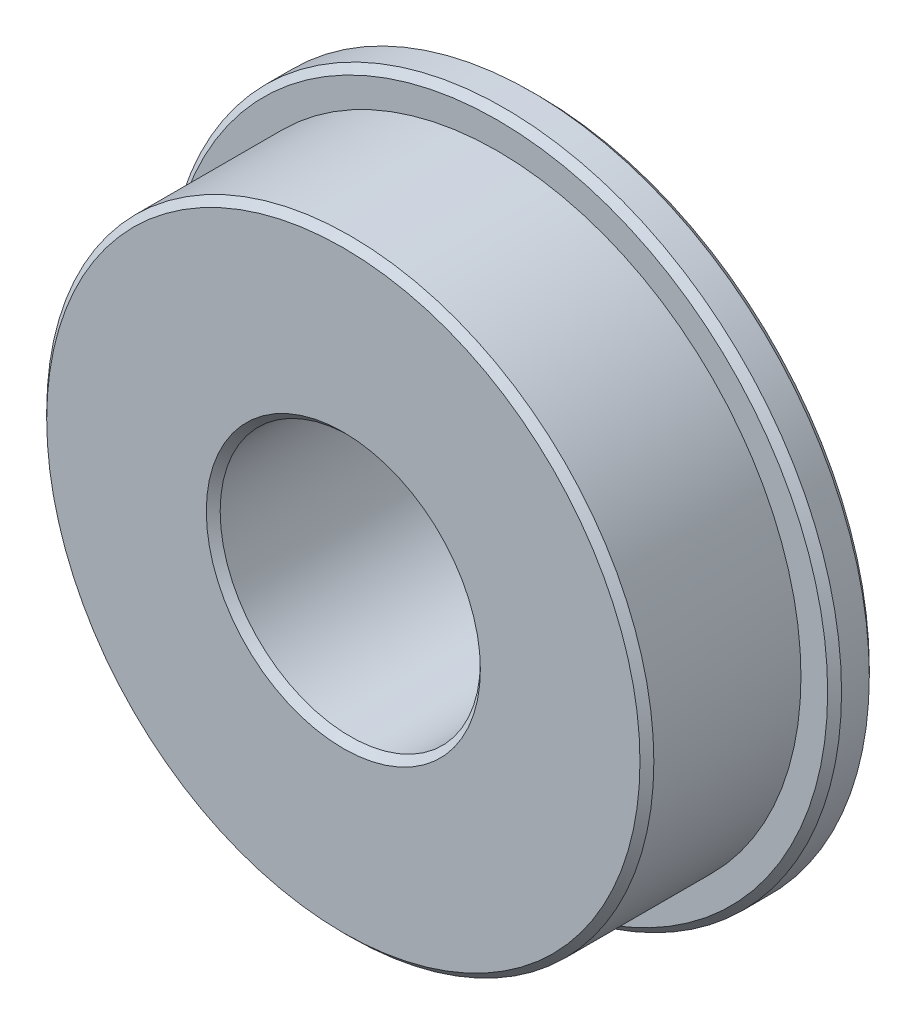
ISO-10303-21;
HEADER;
FILE_DESCRIPTION(('STEP AP214'),'2;1');
FILE_NAME('part.step','',(''),(''),'','','');
FILE_SCHEMA(('AUTOMOTIVE_DESIGN { 1 0 10303 214 1 1 1 1 }'));
ENDSEC;
DATA;
#1=APPLICATION_CONTEXT('core data for automotive mechanical design processes');
#2=APPLICATION_PROTOCOL_DEFINITION('international standard','automotive_design',2000,#1);
#3=PRODUCT_CONTEXT('',#1,'mechanical');
#4=PRODUCT('Part','Part','',(#3));
#5=PRODUCT_RELATED_PRODUCT_CATEGORY('part','',(#4));
#6=PRODUCT_DEFINITION_FORMATION('','',#4);
#7=PRODUCT_DEFINITION_CONTEXT('part definition',#1,'design');
#8=PRODUCT_DEFINITION('design','',#6,#7);
#9=PRODUCT_DEFINITION_SHAPE('','',#8);
#10=(LENGTH_UNIT() NAMED_UNIT(*) SI_UNIT(.MILLI.,.METRE.));
#11=(NAMED_UNIT(*) PLANE_ANGLE_UNIT() SI_UNIT($,.RADIAN.));
#12=(NAMED_UNIT(*) SI_UNIT($,.STERADIAN.) SOLID_ANGLE_UNIT());
#13=UNCERTAINTY_MEASURE_WITH_UNIT(LENGTH_MEASURE(1.E-05),#10,'distance_accuracy_value','');
#14=(GEOMETRIC_REPRESENTATION_CONTEXT(3) GLOBAL_UNCERTAINTY_ASSIGNED_CONTEXT((#13)) GLOBAL_UNIT_ASSIGNED_CONTEXT((#10,
#11,#12)) REPRESENTATION_CONTEXT('',''));
#15=CARTESIAN_POINT('',(0.,0.,0.));
#16=DIRECTION('',(0.,0.,1.));
#17=DIRECTION('',(1.,0.,0.));
#18=AXIS2_PLACEMENT_3D('',#15,#16,#17);
#19=CARTESIAN_POINT('',(-8.86153846153845,6.04195804195806,-7.37869999999988));
#20=DIRECTION('',(0.,0.,-1.));
#21=DIRECTION('',(0.,-1.,0.));
#22=AXIS2_PLACEMENT_3D('',#19,#20,#21);
#23=CONICAL_SURFACE('',#22,25.4,0.78539816339745);
#24=CARTESIAN_POINT('',(-8.86153846153845,6.04195804195806,7.16280000000003));
#25=DIRECTION('',(0.,0.,1.));
#26=DIRECTION('',(1.,0.,0.));
#27=AXIS2_PLACEMENT_3D('',#24,#25,#26);
#28=CIRCLE('',#27,10.8585);
#29=CARTESIAN_POINT('',(1.99696153846156,6.04195804195806,7.16280000000003));
#30=VERTEX_POINT('',#29);
#31=EDGE_CURVE('E31',#30,#30,#28,.T.);
#32=ORIENTED_EDGE('',*,*,#31,.F.);
#33=EDGE_LOOP('',(#32));
#34=FACE_BOUND('',#33,.T.);
#35=CARTESIAN_POINT('',(-8.86153846153845,6.04195804195806,6.90880000000005));
#36=DIRECTION('',(0.,0.,-1.));
#37=DIRECTION('',(0.,-1.,0.));
#38=AXIS2_PLACEMENT_3D('',#35,#36,#37);
#39=CIRCLE('',#38,11.1125);
#40=CARTESIAN_POINT('',(-8.86153846153845,-5.07054195804195,6.90880000000005));
#41=VERTEX_POINT('',#40);
#42=EDGE_CURVE('E10',#41,#41,#39,.T.);
#43=ORIENTED_EDGE('',*,*,#42,.F.);
#44=EDGE_LOOP('',(#43));
#45=FACE_BOUND('',#44,.T.);
#46=ADVANCED_FACE('F14',(#34,#45),#23,.T.);
#47=CARTESIAN_POINT('',(-8.86153846153845,6.04195804195806,-11.7855999999999));
#48=DIRECTION('',(0.,0.,-1.));
#49=DIRECTION('',(0.,-1.,0.));
#50=AXIS2_PLACEMENT_3D('',#47,#48,#49);
#51=CONICAL_SURFACE('',#50,25.4,0.78539816339745);
#52=CARTESIAN_POINT('',(-8.86153846153845,6.04195804195806,1.52399999999997));
#53=DIRECTION('',(0.,0.,1.));
#54=DIRECTION('',(1.,0.,0.));
#55=AXIS2_PLACEMENT_3D('',#52,#53,#54);
#56=CIRCLE('',#55,12.0904);
#57=CARTESIAN_POINT('',(3.22886153846155,6.04195804195806,1.52399999999997));
#58=VERTEX_POINT('',#57);
#59=EDGE_CURVE('E32',#58,#58,#56,.T.);
#60=ORIENTED_EDGE('',*,*,#59,.F.);
#61=EDGE_LOOP('',(#60));
#62=FACE_BOUND('',#61,.T.);
#63=CARTESIAN_POINT('',(-8.86153846153845,6.04195804195806,1.26999999999999));
#64=DIRECTION('',(0.,0.,-1.));
#65=DIRECTION('',(0.,-1.,0.));
#66=AXIS2_PLACEMENT_3D('',#63,#64,#65);
#67=CIRCLE('',#66,12.3444);
#68=CARTESIAN_POINT('',(-8.86153846153845,-6.30244195804195,1.26999999999999));
#69=VERTEX_POINT('',#68);
#70=EDGE_CURVE('E27',#69,#69,#67,.T.);
#71=ORIENTED_EDGE('',*,*,#70,.F.);
#72=EDGE_LOOP('',(#71));
#73=FACE_BOUND('',#72,.T.);
#74=ADVANCED_FACE('F72',(#62,#73),#51,.T.);
#75=CARTESIAN_POINT('',(-8.86153846153845,6.04195804195806,13.3095999999999));
#76=DIRECTION('',(0.,0.,1.));
#77=DIRECTION('',(1.,0.,0.));
#78=AXIS2_PLACEMENT_3D('',#75,#76,#77);
#79=CONICAL_SURFACE('',#78,25.4,0.78539816339745);
#80=CARTESIAN_POINT('',(-8.86153846153845,6.04195804195806,0.));
#81=DIRECTION('',(0.,0.,-1.));
#82=DIRECTION('',(0.,-1.,0.));
#83=AXIS2_PLACEMENT_3D('',#80,#81,#82);
#84=CIRCLE('',#83,12.0904);
#85=CARTESIAN_POINT('',(-8.86153846153845,-6.04844195804194,0.));
#86=VERTEX_POINT('',#85);
#87=EDGE_CURVE('E39',#86,#86,#84,.T.);
#88=ORIENTED_EDGE('',*,*,#87,.F.);
#89=EDGE_LOOP('',(#88));
#90=FACE_BOUND('',#89,.T.);
#91=CARTESIAN_POINT('',(-8.86153846153845,6.04195804195806,0.253999999999976));
#92=DIRECTION('',(0.,0.,1.));
#93=DIRECTION('',(1.,0.,0.));
#94=AXIS2_PLACEMENT_3D('',#91,#92,#93);
#95=CIRCLE('',#94,12.3444);
#96=CARTESIAN_POINT('',(3.48286153846156,6.04195804195806,0.253999999999976));
#97=VERTEX_POINT('',#96);
#98=EDGE_CURVE('E22',#97,#97,#95,.T.);
#99=ORIENTED_EDGE('',*,*,#98,.F.);
#100=EDGE_LOOP('',(#99));
#101=FACE_BOUND('',#100,.T.);
#102=ADVANCED_FACE('F16',(#90,#101),#79,.T.);
#103=CARTESIAN_POINT('',(-8.86153846153845,6.04195804195806,27.5463000000001));
#104=DIRECTION('',(0.,0.,1.));
#105=DIRECTION('',(1.,0.,0.));
#106=AXIS2_PLACEMENT_3D('',#103,#104,#105);
#107=CONICAL_SURFACE('',#106,25.4,0.785398163397448);
#108=CARTESIAN_POINT('',(-8.86153846153845,6.04195804195806,6.90880000000005));
#109=DIRECTION('',(0.,0.,1.));
#110=DIRECTION('',(1.,0.,0.));
#111=AXIS2_PLACEMENT_3D('',#108,#109,#110);
#112=CIRCLE('',#111,4.7625);
#113=CARTESIAN_POINT('',(-4.09903846153845,6.04195804195806,6.90880000000005));
#114=VERTEX_POINT('',#113);
#115=EDGE_CURVE('E35',#114,#114,#112,.T.);
#116=ORIENTED_EDGE('',*,*,#115,.F.);
#117=EDGE_LOOP('',(#116));
#118=FACE_BOUND('',#117,.T.);
#119=CARTESIAN_POINT('',(-8.86153846153845,6.04195804195806,7.16280000000003));
#120=DIRECTION('',(0.,0.,-1.));
#121=DIRECTION('',(0.,-1.,0.));
#122=AXIS2_PLACEMENT_3D('',#119,#120,#121);
#123=CIRCLE('',#122,5.0165);
#124=CARTESIAN_POINT('',(-8.86153846153845,1.02545804195806,7.16280000000003));
#125=VERTEX_POINT('',#124);
#126=EDGE_CURVE('E41',#125,#125,#123,.T.);
#127=ORIENTED_EDGE('',*,*,#126,.F.);
#128=EDGE_LOOP('',(#127));
#129=FACE_BOUND('',#128,.T.);
#130=ADVANCED_FACE('F57',(#118,#129),#107,.F.);
#131=CARTESIAN_POINT('',(-8.86153846153845,6.04195804195806,-20.3834999999999));
#132=DIRECTION('',(0.,0.,-1.));
#133=DIRECTION('',(0.,-1.,0.));
#134=AXIS2_PLACEMENT_3D('',#131,#132,#133);
#135=CONICAL_SURFACE('',#134,25.4,0.78539816339745);
#136=CARTESIAN_POINT('',(-8.86153846153845,6.04195804195806,0.253999999999976));
#137=DIRECTION('',(0.,0.,-1.));
#138=DIRECTION('',(0.,-1.,0.));
#139=AXIS2_PLACEMENT_3D('',#136,#137,#138);
#140=CIRCLE('',#139,4.7625);
#141=CARTESIAN_POINT('',(-8.86153846153845,1.27945804195806,0.253999999999976));
#142=VERTEX_POINT('',#141);
#143=EDGE_CURVE('E38',#142,#142,#140,.T.);
#144=ORIENTED_EDGE('',*,*,#143,.F.);
#145=EDGE_LOOP('',(#144));
#146=FACE_BOUND('',#145,.T.);
#147=CARTESIAN_POINT('',(-8.86153846153845,6.04195804195806,0.));
#148=DIRECTION('',(0.,0.,1.));
#149=DIRECTION('',(1.,0.,0.));
#150=AXIS2_PLACEMENT_3D('',#147,#148,#149);
#151=CIRCLE('',#150,5.0165);
#152=CARTESIAN_POINT('',(-3.84503846153845,6.04195804195806,0.));
#153=VERTEX_POINT('',#152);
#154=EDGE_CURVE('E42',#153,#153,#151,.T.);
#155=ORIENTED_EDGE('',*,*,#154,.F.);
#156=EDGE_LOOP('',(#155));
#157=FACE_BOUND('',#156,.T.);
#158=ADVANCED_FACE('F54',(#146,#157),#135,.F.);
#159=CARTESIAN_POINT('',(-8.86153846153845,6.04195804195806,7.16280000000003));
#160=DIRECTION('',(0.,0.,1.));
#161=DIRECTION('',(1.,0.,0.));
#162=AXIS2_PLACEMENT_3D('',#159,#160,#161);
#163=CYLINDRICAL_SURFACE('',#162,11.1125);
#164=CARTESIAN_POINT('',(-8.86153846153845,6.04195804195806,1.52399999999997));
#165=DIRECTION('',(0.,0.,-1.));
#166=DIRECTION('',(0.,-1.,0.));
#167=AXIS2_PLACEMENT_3D('',#164,#165,#166);
#168=CIRCLE('',#167,11.1125);
#169=CARTESIAN_POINT('',(-8.86153846153845,-5.07054195804196,1.52399999999997));
#170=VERTEX_POINT('',#169);
#171=EDGE_CURVE('E18',#170,#170,#168,.T.);
#172=ORIENTED_EDGE('',*,*,#171,.F.);
#173=EDGE_LOOP('',(#172));
#174=FACE_BOUND('',#173,.T.);
#175=ORIENTED_EDGE('',*,*,#42,.T.);
#176=EDGE_LOOP('',(#175));
#177=FACE_BOUND('',#176,.T.);
#178=ADVANCED_FACE('F56',(#174,#177),#163,.T.);
#179=CARTESIAN_POINT('',(-8.86153846153845,6.04195804195806,1.52399999999997));
#180=DIRECTION('',(0.,0.,1.));
#181=DIRECTION('',(1.,0.,0.));
#182=AXIS2_PLACEMENT_3D('',#179,#180,#181);
#183=CYLINDRICAL_SURFACE('',#182,12.3444);
#184=ORIENTED_EDGE('',*,*,#98,.T.);
#185=EDGE_LOOP('',(#184));
#186=FACE_BOUND('',#185,.T.);
#187=ORIENTED_EDGE('',*,*,#70,.T.);
#188=EDGE_LOOP('',(#187));
#189=FACE_BOUND('',#188,.T.);
#190=ADVANCED_FACE('F65',(#186,#189),#183,.T.);
#191=CARTESIAN_POINT('',(-8.86153846153845,6.04195804195806,1.52399999999997));
#192=DIRECTION('',(0.,0.,1.));
#193=DIRECTION('',(1.,0.,0.));
#194=AXIS2_PLACEMENT_3D('',#191,#192,#193);
#195=CYLINDRICAL_SURFACE('',#194,4.7625);
#196=ORIENTED_EDGE('',*,*,#143,.T.);
#197=EDGE_LOOP('',(#196));
#198=FACE_BOUND('',#197,.T.);
#199=ORIENTED_EDGE('',*,*,#115,.T.);
#200=EDGE_LOOP('',(#199));
#201=FACE_BOUND('',#200,.T.);
#202=ADVANCED_FACE('F92',(#198,#201),#195,.F.);
#203=CARTESIAN_POINT('',(-8.86153846153845,6.04195804195806,1.52399999999997));
#204=DIRECTION('',(0.,0.,-1.));
#205=DIRECTION('',(-1.,0.,0.));
#206=AXIS2_PLACEMENT_3D('',#203,#204,#205);
#207=PLANE('',#206);
#208=ORIENTED_EDGE('',*,*,#59,.T.);
#209=EDGE_LOOP('',(#208));
#210=FACE_BOUND('',#209,.T.);
#211=ORIENTED_EDGE('',*,*,#171,.T.);
#212=EDGE_LOOP('',(#211));
#213=FACE_BOUND('',#212,.T.);
#214=ADVANCED_FACE('F89',(#210,#213),#207,.F.);
#215=CARTESIAN_POINT('',(-8.86153846153845,6.04195804195806,7.16280000000003));
#216=DIRECTION('',(0.,0.,-1.));
#217=DIRECTION('',(-1.,0.,0.));
#218=AXIS2_PLACEMENT_3D('',#215,#216,#217);
#219=PLANE('',#218);
#220=ORIENTED_EDGE('',*,*,#31,.T.);
#221=EDGE_LOOP('',(#220));
#222=FACE_BOUND('',#221,.T.);
#223=ORIENTED_EDGE('',*,*,#126,.T.);
#224=EDGE_LOOP('',(#223));
#225=FACE_BOUND('',#224,.T.);
#226=ADVANCED_FACE('F85',(#222,#225),#219,.F.);
#227=CARTESIAN_POINT('',(-8.86153846153845,6.04195804195806,0.));
#228=DIRECTION('',(0.,0.,-1.));
#229=DIRECTION('',(-1.,0.,0.));
#230=AXIS2_PLACEMENT_3D('',#227,#228,#229);
#231=PLANE('',#230);
#232=ORIENTED_EDGE('',*,*,#87,.T.);
#233=EDGE_LOOP('',(#232));
#234=FACE_BOUND('',#233,.T.);
#235=ORIENTED_EDGE('',*,*,#154,.T.);
#236=EDGE_LOOP('',(#235));
#237=FACE_BOUND('',#236,.T.);
#238=ADVANCED_FACE('F52',(#234,#237),#231,.T.);
#239=CLOSED_SHELL('',(#46,#74,#102,#130,#158,#178,#190,#202,#214,#226,#238));
#240=MANIFOLD_SOLID_BREP('B1',#239);
#241=ADVANCED_BREP_SHAPE_REPRESENTATION('',(#18,#240),#14);
#242=SHAPE_DEFINITION_REPRESENTATION(#9,#241);
ENDSEC;
END-ISO-10303-21;
